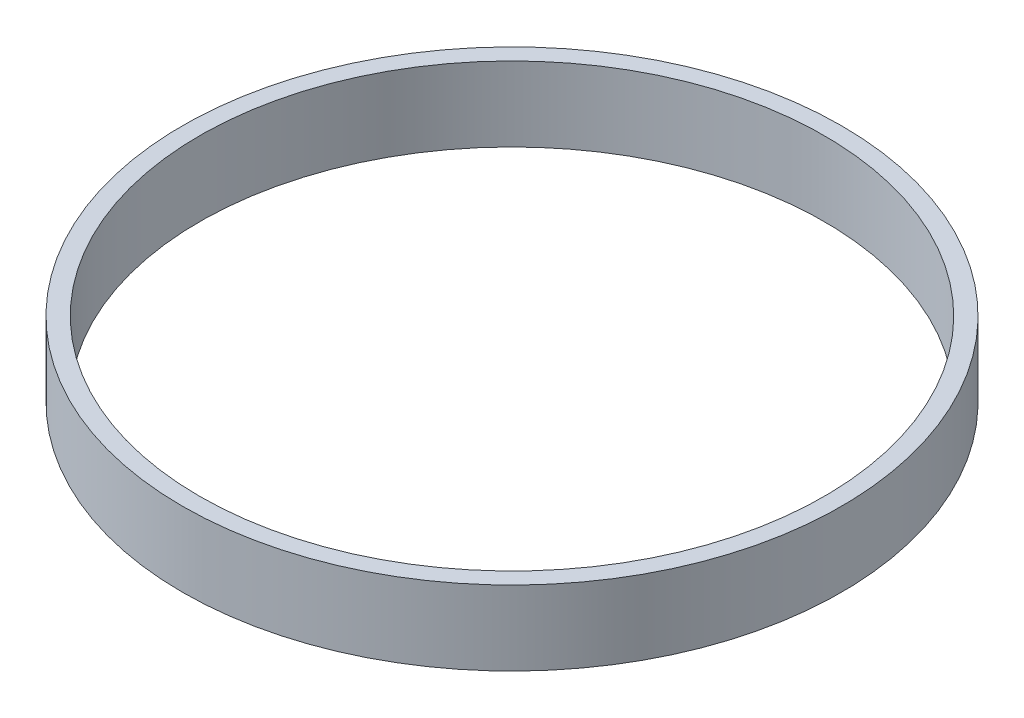
ISO-10303-21;
HEADER;
FILE_DESCRIPTION(('STEP AP214'),'2;1');
FILE_NAME('part.step','',(''),(''),'','','');
FILE_SCHEMA(('AUTOMOTIVE_DESIGN { 1 0 10303 214 1 1 1 1 }'));
ENDSEC;
DATA;
#1=APPLICATION_CONTEXT('core data for automotive mechanical design processes');
#2=APPLICATION_PROTOCOL_DEFINITION('international standard','automotive_design',2000,#1);
#3=PRODUCT_CONTEXT('',#1,'mechanical');
#4=PRODUCT('Part','Part','',(#3));
#5=PRODUCT_RELATED_PRODUCT_CATEGORY('part','',(#4));
#6=PRODUCT_DEFINITION_FORMATION('','',#4);
#7=PRODUCT_DEFINITION_CONTEXT('part definition',#1,'design');
#8=PRODUCT_DEFINITION('design','',#6,#7);
#9=PRODUCT_DEFINITION_SHAPE('','',#8);
#10=(LENGTH_UNIT() NAMED_UNIT(*) SI_UNIT(.MILLI.,.METRE.));
#11=(NAMED_UNIT(*) PLANE_ANGLE_UNIT() SI_UNIT($,.RADIAN.));
#12=(NAMED_UNIT(*) SI_UNIT($,.STERADIAN.) SOLID_ANGLE_UNIT());
#13=UNCERTAINTY_MEASURE_WITH_UNIT(LENGTH_MEASURE(1.E-05),#10,'distance_accuracy_value','');
#14=(GEOMETRIC_REPRESENTATION_CONTEXT(3) GLOBAL_UNCERTAINTY_ASSIGNED_CONTEXT((#13)) GLOBAL_UNIT_ASSIGNED_CONTEXT((#10,
#11,#12)) REPRESENTATION_CONTEXT('',''));
#15=CARTESIAN_POINT('',(0.,0.,0.));
#16=DIRECTION('',(0.,0.,1.));
#17=DIRECTION('',(1.,0.,0.));
#18=AXIS2_PLACEMENT_3D('',#15,#16,#17);
#19=CARTESIAN_POINT('',(0.,13.,0.));
#20=DIRECTION('',(0.,-1.,0.));
#21=DIRECTION('',(0.,0.,-1.));
#22=AXIS2_PLACEMENT_3D('',#19,#20,#21);
#23=CYLINDRICAL_SURFACE('',#22,57.5);
#24=CARTESIAN_POINT('',(0.,13.,0.));
#25=DIRECTION('',(0.,1.,0.));
#26=DIRECTION('',(0.,0.,1.));
#27=AXIS2_PLACEMENT_3D('',#24,#25,#26);
#28=CIRCLE('',#27,57.5);
#29=CARTESIAN_POINT('',(0.,13.,-57.5));
#30=VERTEX_POINT('',#29);
#31=EDGE_CURVE('E10',#30,#30,#28,.T.);
#32=CARTESIAN_POINT('',(0.,0.,0.));
#33=DIRECTION('',(0.,1.,0.));
#34=DIRECTION('',(0.,0.,1.));
#35=AXIS2_PLACEMENT_3D('',#32,#33,#34);
#36=CIRCLE('',#35,57.5);
#37=CARTESIAN_POINT('',(0.,0.,-57.5));
#38=VERTEX_POINT('',#37);
#39=EDGE_CURVE('E40',#38,#38,#36,.T.);
#40=CARTESIAN_POINT('',(0.,13.,-57.5));
#41=CARTESIAN_POINT('',(0.,12.8645833333333,-57.5));
#42=CARTESIAN_POINT('',(0.,12.7291666666667,-57.5));
#43=CARTESIAN_POINT('',(0.,12.4583333333333,-57.5));
#44=CARTESIAN_POINT('',(0.,12.3229166666667,-57.5));
#45=CARTESIAN_POINT('',(0.,12.0520833333333,-57.5));
#46=CARTESIAN_POINT('',(0.,11.9166666666667,-57.5));
#47=CARTESIAN_POINT('',(0.,11.6458333333333,-57.5));
#48=CARTESIAN_POINT('',(0.,11.5104166666667,-57.5));
#49=CARTESIAN_POINT('',(0.,11.2395833333333,-57.5));
#50=CARTESIAN_POINT('',(0.,11.1041666666667,-57.5));
#51=CARTESIAN_POINT('',(0.,10.8333333333333,-57.5));
#52=CARTESIAN_POINT('',(0.,10.6979166666667,-57.5));
#53=CARTESIAN_POINT('',(0.,10.4270833333333,-57.5));
#54=CARTESIAN_POINT('',(0.,10.2916666666667,-57.5));
#55=CARTESIAN_POINT('',(0.,10.0208333333333,-57.5));
#56=CARTESIAN_POINT('',(0.,9.88541666666667,-57.5));
#57=CARTESIAN_POINT('',(0.,9.61458333333333,-57.5));
#58=CARTESIAN_POINT('',(0.,9.47916666666667,-57.5));
#59=CARTESIAN_POINT('',(0.,9.20833333333333,-57.5));
#60=CARTESIAN_POINT('',(0.,9.07291666666667,-57.5));
#61=CARTESIAN_POINT('',(0.,8.80208333333333,-57.5));
#62=CARTESIAN_POINT('',(0.,8.66666666666667,-57.5));
#63=CARTESIAN_POINT('',(0.,8.39583333333333,-57.5));
#64=CARTESIAN_POINT('',(0.,8.26041666666667,-57.5));
#65=CARTESIAN_POINT('',(0.,7.98958333333333,-57.5));
#66=CARTESIAN_POINT('',(0.,7.85416666666667,-57.5));
#67=CARTESIAN_POINT('',(0.,7.58333333333333,-57.5));
#68=CARTESIAN_POINT('',(0.,7.44791666666667,-57.5));
#69=CARTESIAN_POINT('',(0.,7.17708333333333,-57.5));
#70=CARTESIAN_POINT('',(0.,7.04166666666667,-57.5));
#71=CARTESIAN_POINT('',(0.,6.77083333333333,-57.5));
#72=CARTESIAN_POINT('',(0.,6.63541666666667,-57.5));
#73=CARTESIAN_POINT('',(0.,6.36458333333333,-57.5));
#74=CARTESIAN_POINT('',(0.,6.22916666666667,-57.5));
#75=CARTESIAN_POINT('',(0.,5.95833333333333,-57.5));
#76=CARTESIAN_POINT('',(0.,5.82291666666667,-57.5));
#77=CARTESIAN_POINT('',(0.,5.55208333333333,-57.5));
#78=CARTESIAN_POINT('',(0.,5.41666666666667,-57.5));
#79=CARTESIAN_POINT('',(0.,5.14583333333333,-57.5));
#80=CARTESIAN_POINT('',(0.,5.01041666666667,-57.5));
#81=CARTESIAN_POINT('',(0.,4.73958333333333,-57.5));
#82=CARTESIAN_POINT('',(0.,4.60416666666667,-57.5));
#83=CARTESIAN_POINT('',(0.,4.33333333333333,-57.5));
#84=CARTESIAN_POINT('',(0.,4.19791666666667,-57.5));
#85=CARTESIAN_POINT('',(0.,3.92708333333333,-57.5));
#86=CARTESIAN_POINT('',(0.,3.79166666666667,-57.5));
#87=CARTESIAN_POINT('',(0.,3.52083333333333,-57.5));
#88=CARTESIAN_POINT('',(0.,3.38541666666667,-57.5));
#89=CARTESIAN_POINT('',(0.,3.11458333333333,-57.5));
#90=CARTESIAN_POINT('',(0.,2.97916666666667,-57.5));
#91=CARTESIAN_POINT('',(0.,2.70833333333333,-57.5));
#92=CARTESIAN_POINT('',(0.,2.57291666666667,-57.5));
#93=CARTESIAN_POINT('',(0.,2.30208333333333,-57.5));
#94=CARTESIAN_POINT('',(0.,2.16666666666667,-57.5));
#95=CARTESIAN_POINT('',(0.,1.89583333333333,-57.5));
#96=CARTESIAN_POINT('',(0.,1.76041666666667,-57.5));
#97=CARTESIAN_POINT('',(0.,1.48958333333333,-57.5));
#98=CARTESIAN_POINT('',(0.,1.35416666666667,-57.5));
#99=CARTESIAN_POINT('',(0.,1.08333333333333,-57.5));
#100=CARTESIAN_POINT('',(0.,0.947916666666667,-57.5));
#101=CARTESIAN_POINT('',(0.,0.677083333333334,-57.5));
#102=CARTESIAN_POINT('',(0.,0.541666666666667,-57.5));
#103=CARTESIAN_POINT('',(0.,0.270833333333334,-57.5));
#104=CARTESIAN_POINT('',(0.,0.135416666666667,-57.5));
#105=CARTESIAN_POINT('',(0.,0.,-57.5));
#106=B_SPLINE_CURVE_WITH_KNOTS('',3,(#40,#41,#42,#43,#44,#45,#46,#47,#48,#49,#50,#51,#52,#53,
#54,#55,#56,#57,#58,#59,#60,#61,#62,#63,#64,#65,#66,#67,#68,#69,#70,#71,#72,#73,#74,#75,#76,#77,
#78,#79,#80,#81,#82,#83,#84,#85,#86,#87,#88,#89,#90,#91,#92,#93,#94,#95,#96,#97,#98,#99,#100,
#101,#102,#103,#104,#105),.UNSPECIFIED.,.F.,.F.,(4,2,2,2,2,2,2,2,2,2,2,2,2,2,2,2,2,2,2,2,2,2,2,
2,2,2,2,2,2,2,2,2,4),(0.,0.406249999999999,0.812499999999999,1.21875,1.625,2.03125,2.4375,
2.84375,3.25,3.65625,4.0625,4.46875,4.875,5.28125,5.6875,6.09375,6.5,6.90625,7.3125,7.71875,
8.125,8.53125,8.9375,9.34375,9.75,10.15625,10.5625,10.96875,11.375,11.78125,12.1875,12.59375,
13.),.UNSPECIFIED.);
#107=EDGE_CURVE('BSEAM37',#30,#38,#106,.T.);
#108=ORIENTED_EDGE('',*,*,#31,.F.);
#109=ORIENTED_EDGE('',*,*,#39,.T.);
#110=ORIENTED_EDGE('',*,*,#107,.T.);
#111=ORIENTED_EDGE('',*,*,#107,.F.);
#112=EDGE_LOOP('',(#108,#110,#109,#111));
#113=FACE_BOUND('',#112,.T.);
#114=ADVANCED_FACE('F37',(#113),#23,.T.);
#115=CARTESIAN_POINT('',(0.,13.,0.));
#116=DIRECTION('',(0.,1.,0.));
#117=DIRECTION('',(0.,0.,1.));
#118=AXIS2_PLACEMENT_3D('',#115,#116,#117);
#119=PLANE('',#118);
#120=CARTESIAN_POINT('',(0.,13.,0.));
#121=DIRECTION('',(0.,1.,0.));
#122=DIRECTION('',(0.,0.,1.));
#123=AXIS2_PLACEMENT_3D('',#120,#121,#122);
#124=CIRCLE('',#123,54.5);
#125=CARTESIAN_POINT('',(0.,13.,54.5));
#126=VERTEX_POINT('',#125);
#127=EDGE_CURVE('E51',#126,#126,#124,.T.);
#128=ORIENTED_EDGE('',*,*,#127,.F.);
#129=EDGE_LOOP('',(#128));
#130=FACE_BOUND('',#129,.T.);
#131=ORIENTED_EDGE('',*,*,#31,.T.);
#132=EDGE_LOOP('',(#131));
#133=FACE_BOUND('',#132,.T.);
#134=ADVANCED_FACE('F68',(#130,#133),#119,.T.);
#135=CARTESIAN_POINT('',(0.,0.,0.));
#136=DIRECTION('',(0.,1.,0.));
#137=DIRECTION('',(0.,0.,1.));
#138=AXIS2_PLACEMENT_3D('',#135,#136,#137);
#139=PLANE('',#138);
#140=CARTESIAN_POINT('',(0.,0.,0.));
#141=DIRECTION('',(0.,1.,0.));
#142=DIRECTION('',(0.,0.,1.));
#143=AXIS2_PLACEMENT_3D('',#140,#141,#142);
#144=CIRCLE('',#143,54.5);
#145=CARTESIAN_POINT('',(0.,0.,54.5));
#146=VERTEX_POINT('',#145);
#147=EDGE_CURVE('E49',#146,#146,#144,.T.);
#148=ORIENTED_EDGE('',*,*,#147,.T.);
#149=EDGE_LOOP('',(#148));
#150=FACE_BOUND('',#149,.T.);
#151=ORIENTED_EDGE('',*,*,#39,.F.);
#152=EDGE_LOOP('',(#151));
#153=FACE_BOUND('',#152,.T.);
#154=ADVANCED_FACE('F59',(#150,#153),#139,.F.);
#155=CARTESIAN_POINT('',(0.,0.,0.));
#156=DIRECTION('',(0.,1.,0.));
#157=DIRECTION('',(0.,0.,1.));
#158=AXIS2_PLACEMENT_3D('',#155,#156,#157);
#159=CYLINDRICAL_SURFACE('',#158,54.5);
#160=CARTESIAN_POINT('',(0.,0.,54.5));
#161=CARTESIAN_POINT('',(0.,0.135416666666666,54.5));
#162=CARTESIAN_POINT('',(0.,0.270833333333333,54.5));
#163=CARTESIAN_POINT('',(0.,0.541666666666667,54.5));
#164=CARTESIAN_POINT('',(0.,0.677083333333333,54.5));
#165=CARTESIAN_POINT('',(0.,0.947916666666667,54.5));
#166=CARTESIAN_POINT('',(0.,1.08333333333333,54.5));
#167=CARTESIAN_POINT('',(0.,1.35416666666667,54.5));
#168=CARTESIAN_POINT('',(0.,1.48958333333333,54.5));
#169=CARTESIAN_POINT('',(0.,1.76041666666667,54.5));
#170=CARTESIAN_POINT('',(0.,1.89583333333333,54.5));
#171=CARTESIAN_POINT('',(0.,2.16666666666667,54.5));
#172=CARTESIAN_POINT('',(0.,2.30208333333333,54.5));
#173=CARTESIAN_POINT('',(0.,2.57291666666667,54.5));
#174=CARTESIAN_POINT('',(0.,2.70833333333333,54.5));
#175=CARTESIAN_POINT('',(0.,2.97916666666667,54.5));
#176=CARTESIAN_POINT('',(0.,3.11458333333333,54.5));
#177=CARTESIAN_POINT('',(0.,3.38541666666667,54.5));
#178=CARTESIAN_POINT('',(0.,3.52083333333333,54.5));
#179=CARTESIAN_POINT('',(0.,3.79166666666667,54.5));
#180=CARTESIAN_POINT('',(0.,3.92708333333333,54.5));
#181=CARTESIAN_POINT('',(0.,4.19791666666667,54.5));
#182=CARTESIAN_POINT('',(0.,4.33333333333333,54.5));
#183=CARTESIAN_POINT('',(0.,4.60416666666667,54.5));
#184=CARTESIAN_POINT('',(0.,4.73958333333333,54.5));
#185=CARTESIAN_POINT('',(0.,5.01041666666667,54.5));
#186=CARTESIAN_POINT('',(0.,5.14583333333333,54.5));
#187=CARTESIAN_POINT('',(0.,5.41666666666667,54.5));
#188=CARTESIAN_POINT('',(0.,5.55208333333333,54.5));
#189=CARTESIAN_POINT('',(0.,5.82291666666667,54.5));
#190=CARTESIAN_POINT('',(0.,5.95833333333333,54.5));
#191=CARTESIAN_POINT('',(0.,6.22916666666667,54.5));
#192=CARTESIAN_POINT('',(0.,6.36458333333333,54.5));
#193=CARTESIAN_POINT('',(0.,6.63541666666667,54.5));
#194=CARTESIAN_POINT('',(0.,6.77083333333333,54.5));
#195=CARTESIAN_POINT('',(0.,7.04166666666667,54.5));
#196=CARTESIAN_POINT('',(0.,7.17708333333333,54.5));
#197=CARTESIAN_POINT('',(0.,7.44791666666667,54.5));
#198=CARTESIAN_POINT('',(0.,7.58333333333333,54.5));
#199=CARTESIAN_POINT('',(0.,7.85416666666667,54.5));
#200=CARTESIAN_POINT('',(0.,7.98958333333333,54.5));
#201=CARTESIAN_POINT('',(0.,8.26041666666667,54.5));
#202=CARTESIAN_POINT('',(0.,8.39583333333333,54.5));
#203=CARTESIAN_POINT('',(0.,8.66666666666667,54.5));
#204=CARTESIAN_POINT('',(0.,8.80208333333333,54.5));
#205=CARTESIAN_POINT('',(0.,9.07291666666667,54.5));
#206=CARTESIAN_POINT('',(0.,9.20833333333333,54.5));
#207=CARTESIAN_POINT('',(0.,9.47916666666667,54.5));
#208=CARTESIAN_POINT('',(0.,9.61458333333333,54.5));
#209=CARTESIAN_POINT('',(0.,9.88541666666667,54.5));
#210=CARTESIAN_POINT('',(0.,10.0208333333333,54.5));
#211=CARTESIAN_POINT('',(0.,10.2916666666667,54.5));
#212=CARTESIAN_POINT('',(0.,10.4270833333333,54.5));
#213=CARTESIAN_POINT('',(0.,10.6979166666667,54.5));
#214=CARTESIAN_POINT('',(0.,10.8333333333333,54.5));
#215=CARTESIAN_POINT('',(0.,11.1041666666667,54.5));
#216=CARTESIAN_POINT('',(0.,11.2395833333333,54.5));
#217=CARTESIAN_POINT('',(0.,11.5104166666667,54.5));
#218=CARTESIAN_POINT('',(0.,11.6458333333333,54.5));
#219=CARTESIAN_POINT('',(0.,11.9166666666667,54.5));
#220=CARTESIAN_POINT('',(0.,12.0520833333333,54.5));
#221=CARTESIAN_POINT('',(0.,12.3229166666667,54.5));
#222=CARTESIAN_POINT('',(0.,12.4583333333333,54.5));
#223=CARTESIAN_POINT('',(0.,12.7291666666667,54.5));
#224=CARTESIAN_POINT('',(0.,12.8645833333333,54.5));
#225=CARTESIAN_POINT('',(0.,13.,54.5));
#226=B_SPLINE_CURVE_WITH_KNOTS('',3,(#160,#161,#162,#163,#164,#165,#166,#167,#168,#169,#170,
#171,#172,#173,#174,#175,#176,#177,#178,#179,#180,#181,#182,#183,#184,#185,#186,#187,#188,#189,
#190,#191,#192,#193,#194,#195,#196,#197,#198,#199,#200,#201,#202,#203,#204,#205,#206,#207,#208,
#209,#210,#211,#212,#213,#214,#215,#216,#217,#218,#219,#220,#221,#222,#223,#224,#225),
.UNSPECIFIED.,.F.,.F.,(4,2,2,2,2,2,2,2,2,2,2,2,2,2,2,2,2,2,2,2,2,2,2,2,2,2,2,2,2,2,2,2,4),(0.,
0.40625,0.8125,1.21875,1.625,2.03125,2.4375,2.84375,3.25,3.65625,4.0625,4.46875,4.875,5.28125,
5.6875,6.09375,6.5,6.90625,7.3125,7.71875,8.125,8.53125,8.9375,9.34375,9.75,10.15625,10.5625,
10.96875,11.375,11.78125,12.1875,12.59375,13.),.UNSPECIFIED.);
#227=EDGE_CURVE('BSEAM62',#146,#126,#226,.T.);
#228=ORIENTED_EDGE('',*,*,#147,.F.);
#229=ORIENTED_EDGE('',*,*,#127,.T.);
#230=ORIENTED_EDGE('',*,*,#227,.T.);
#231=ORIENTED_EDGE('',*,*,#227,.F.);
#232=EDGE_LOOP('',(#228,#230,#229,#231));
#233=FACE_BOUND('',#232,.T.);
#234=ADVANCED_FACE('F62',(#233),#159,.F.);
#235=CLOSED_SHELL('',(#114,#134,#154,#234));
#236=MANIFOLD_SOLID_BREP('B2',#235);
#237=ADVANCED_BREP_SHAPE_REPRESENTATION('',(#18,#236),#14);
#238=SHAPE_DEFINITION_REPRESENTATION(#9,#237);
ENDSEC;
END-ISO-10303-21;
